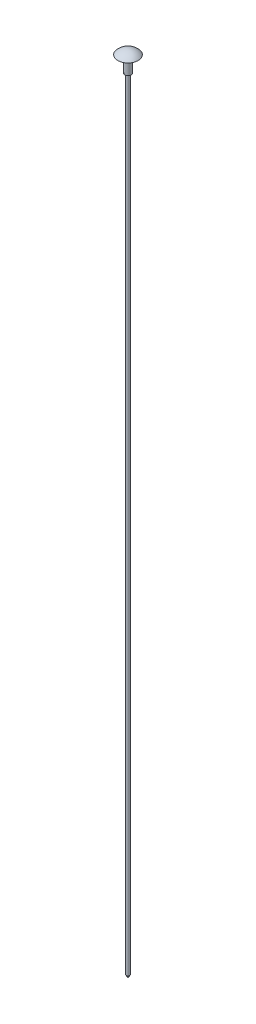
ISO-10303-21;
HEADER;
FILE_DESCRIPTION(('STEP AP214'),'2;1');
FILE_NAME('part.step','',(''),(''),'','','');
FILE_SCHEMA(('AUTOMOTIVE_DESIGN { 1 0 10303 214 1 1 1 1 }'));
ENDSEC;
DATA;
#1=APPLICATION_CONTEXT('core data for automotive mechanical design processes');
#2=APPLICATION_PROTOCOL_DEFINITION('international standard','automotive_design',2000,#1);
#3=PRODUCT_CONTEXT('',#1,'mechanical');
#4=PRODUCT('Part','Part','',(#3));
#5=PRODUCT_RELATED_PRODUCT_CATEGORY('part','',(#4));
#6=PRODUCT_DEFINITION_FORMATION('','',#4);
#7=PRODUCT_DEFINITION_CONTEXT('part definition',#1,'design');
#8=PRODUCT_DEFINITION('design','',#6,#7);
#9=PRODUCT_DEFINITION_SHAPE('','',#8);
#10=(LENGTH_UNIT() NAMED_UNIT(*) SI_UNIT(.MILLI.,.METRE.));
#11=(NAMED_UNIT(*) PLANE_ANGLE_UNIT() SI_UNIT($,.RADIAN.));
#12=(NAMED_UNIT(*) SI_UNIT($,.STERADIAN.) SOLID_ANGLE_UNIT());
#13=UNCERTAINTY_MEASURE_WITH_UNIT(LENGTH_MEASURE(1.E-05),#10,'distance_accuracy_value','');
#14=(GEOMETRIC_REPRESENTATION_CONTEXT(3) GLOBAL_UNCERTAINTY_ASSIGNED_CONTEXT((#13)) GLOBAL_UNIT_ASSIGNED_CONTEXT((#10,
#11,#12)) REPRESENTATION_CONTEXT('',''));
#15=CARTESIAN_POINT('',(0.,0.,0.));
#16=DIRECTION('',(0.,0.,1.));
#17=DIRECTION('',(1.,0.,0.));
#18=AXIS2_PLACEMENT_3D('',#15,#16,#17);
#19=CARTESIAN_POINT('',(-5.9055,1300.,0.));
#20=DIRECTION('',(0.,1.,0.));
#21=DIRECTION('',(0.,0.,1.));
#22=AXIS2_PLACEMENT_3D('',#19,#20,#21);
#23=PLANE('',#22);
#24=CARTESIAN_POINT('',(0.,1300.,0.));
#25=DIRECTION('',(0.,-1.,0.));
#26=DIRECTION('',(0.,0.,-1.));
#27=AXIS2_PLACEMENT_3D('',#24,#25,#26);
#28=CIRCLE('',#27,5.9055);
#29=CARTESIAN_POINT('',(0.,1300.,-5.9055));
#30=VERTEX_POINT('',#29);
#31=EDGE_CURVE('E55',#30,#30,#28,.T.);
#32=ORIENTED_EDGE('',*,*,#31,.F.);
#33=EDGE_LOOP('',(#32));
#34=FACE_BOUND('',#33,.T.);
#35=CARTESIAN_POINT('',(0.,1300.,0.));
#36=DIRECTION('',(0.,-1.,0.));
#37=DIRECTION('',(0.,0.,-1.));
#38=AXIS2_PLACEMENT_3D('',#35,#36,#37);
#39=CIRCLE('',#38,10.7784293699733);
#40=CARTESIAN_POINT('',(0.,1300.,-10.7784293699733));
#41=VERTEX_POINT('',#40);
#42=EDGE_CURVE('E11',#41,#41,#39,.T.);
#43=ORIENTED_EDGE('',*,*,#42,.T.);
#44=EDGE_LOOP('',(#43));
#45=FACE_BOUND('',#44,.T.);
#46=ADVANCED_FACE('F35',(#34,#45),#23,.F.);
#47=CARTESIAN_POINT('',(0.,1300.,0.));
#48=DIRECTION('',(0.,-1.,0.));
#49=DIRECTION('',(0.,0.,-1.));
#50=AXIS2_PLACEMENT_3D('',#47,#48,#49);
#51=CYLINDRICAL_SURFACE('',#50,10.7784293699733);
#52=ORIENTED_EDGE('',*,*,#42,.F.);
#53=EDGE_LOOP('',(#52));
#54=FACE_BOUND('',#53,.T.);
#55=CARTESIAN_POINT('',(0.,1352.88765497768,0.));
#56=DIRECTION('',(0.,-1.,0.));
#57=DIRECTION('',(0.,0.,-1.));
#58=AXIS2_PLACEMENT_3D('',#55,#56,#57);
#59=CIRCLE('',#58,10.7784293699733);
#60=CARTESIAN_POINT('',(0.,1352.88765497768,-10.7784293699733));
#61=VERTEX_POINT('',#60);
#62=EDGE_CURVE('E41',#61,#61,#59,.T.);
#63=ORIENTED_EDGE('',*,*,#62,.T.);
#64=EDGE_LOOP('',(#63));
#65=FACE_BOUND('',#64,.T.);
#66=ADVANCED_FACE('F64',(#54,#65),#51,.T.);
#67=CARTESIAN_POINT('',(-10.7784293699733,1352.88765497768,0.));
#68=DIRECTION('',(0.,1.,0.));
#69=DIRECTION('',(0.,0.,1.));
#70=AXIS2_PLACEMENT_3D('',#67,#68,#69);
#71=PLANE('',#70);
#72=ORIENTED_EDGE('',*,*,#62,.F.);
#73=EDGE_LOOP('',(#72));
#74=FACE_BOUND('',#73,.T.);
#75=CARTESIAN_POINT('',(0.,1352.88765497768,0.));
#76=DIRECTION('',(0.,-1.,0.));
#77=DIRECTION('',(0.,0.,-1.));
#78=AXIS2_PLACEMENT_3D('',#75,#76,#77);
#79=CIRCLE('',#78,33.7761377171716);
#80=CARTESIAN_POINT('',(0.,1352.88765497768,-33.7761377171716));
#81=VERTEX_POINT('',#80);
#82=EDGE_CURVE('E54',#81,#81,#79,.T.);
#83=ORIENTED_EDGE('',*,*,#82,.T.);
#84=EDGE_LOOP('',(#83));
#85=FACE_BOUND('',#84,.T.);
#86=ADVANCED_FACE('F66',(#74,#85),#71,.F.);
#87=CARTESIAN_POINT('',(0.,1321.02019283291,0.));
#88=DIRECTION('',(0.,-1.,0.));
#89=DIRECTION('',(-1.,0.,0.));
#90=AXIS2_PLACEMENT_3D('',#87,#88,#89);
#91=SPHERICAL_SURFACE('',#90,46.4366517164798);
#92=ORIENTED_EDGE('',*,*,#82,.F.);
#93=EDGE_LOOP('',(#92));
#94=FACE_BOUND('',#93,.T.);
#95=ADVANCED_FACE('F48',(#94),#91,.T.);
#96=CARTESIAN_POINT('',(0.,-1289.7713739559,0.));
#97=DIRECTION('',(0.,1.,0.));
#98=DIRECTION('',(0.,0.,1.));
#99=AXIS2_PLACEMENT_3D('',#96,#97,#98);
#100=CONICAL_SURFACE('',#99,5.90549999999968,0.523598775598294);
#101=CARTESIAN_POINT('',(0.,-1300.,0.));
#102=VERTEX_POINT('',#101);
#103=VERTEX_LOOP('',#102);
#104=FACE_BOUND('',#103,.T.);
#105=CARTESIAN_POINT('',(0.,-1289.7713739559,0.));
#106=DIRECTION('',(0.,-1.,0.));
#107=DIRECTION('',(0.,0.,-1.));
#108=AXIS2_PLACEMENT_3D('',#105,#106,#107);
#109=CIRCLE('',#108,5.90549999999968);
#110=CARTESIAN_POINT('',(0.,-1289.7713739559,-5.90549999999968));
#111=VERTEX_POINT('',#110);
#112=EDGE_CURVE('E52',#111,#111,#109,.T.);
#113=ORIENTED_EDGE('',*,*,#112,.T.);
#114=EDGE_LOOP('',(#113));
#115=FACE_BOUND('',#114,.T.);
#116=ADVANCED_FACE('F44',(#104,#115),#100,.T.);
#117=CARTESIAN_POINT('',(0.,1300.,0.));
#118=DIRECTION('',(0.,-1.,0.));
#119=DIRECTION('',(0.,0.,-1.));
#120=AXIS2_PLACEMENT_3D('',#117,#118,#119);
#121=CYLINDRICAL_SURFACE('',#120,5.90549999999984);
#122=ORIENTED_EDGE('',*,*,#112,.F.);
#123=EDGE_LOOP('',(#122));
#124=FACE_BOUND('',#123,.T.);
#125=ORIENTED_EDGE('',*,*,#31,.T.);
#126=EDGE_LOOP('',(#125));
#127=FACE_BOUND('',#126,.T.);
#128=ADVANCED_FACE('F47',(#124,#127),#121,.T.);
#129=CLOSED_SHELL('',(#46,#66,#86,#95,#116,#128));
#130=MANIFOLD_SOLID_BREP('B2',#129);
#131=ADVANCED_BREP_SHAPE_REPRESENTATION('',(#18,#130),#14);
#132=SHAPE_DEFINITION_REPRESENTATION(#9,#131);
ENDSEC;
END-ISO-10303-21;
